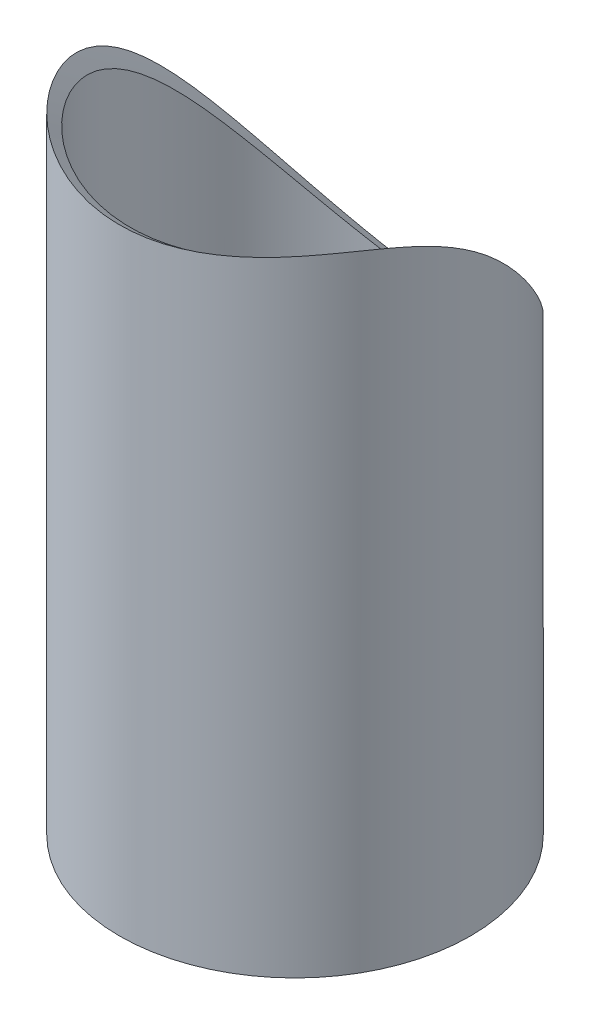
ISO-10303-21;
HEADER;
FILE_DESCRIPTION(('STEP AP214'),'2;1');
FILE_NAME('part.step','',(''),(''),'','','');
FILE_SCHEMA(('AUTOMOTIVE_DESIGN { 1 0 10303 214 1 1 1 1 }'));
ENDSEC;
DATA;
#1=APPLICATION_CONTEXT('core data for automotive mechanical design processes');
#2=APPLICATION_PROTOCOL_DEFINITION('international standard','automotive_design',2000,#1);
#3=PRODUCT_CONTEXT('',#1,'mechanical');
#4=PRODUCT('Part','Part','',(#3));
#5=PRODUCT_RELATED_PRODUCT_CATEGORY('part','',(#4));
#6=PRODUCT_DEFINITION_FORMATION('','',#4);
#7=PRODUCT_DEFINITION_CONTEXT('part definition',#1,'design');
#8=PRODUCT_DEFINITION('design','',#6,#7);
#9=PRODUCT_DEFINITION_SHAPE('','',#8);
#10=(LENGTH_UNIT() NAMED_UNIT(*) SI_UNIT(.MILLI.,.METRE.));
#11=(NAMED_UNIT(*) PLANE_ANGLE_UNIT() SI_UNIT($,.RADIAN.));
#12=(NAMED_UNIT(*) SI_UNIT($,.STERADIAN.) SOLID_ANGLE_UNIT());
#13=UNCERTAINTY_MEASURE_WITH_UNIT(LENGTH_MEASURE(1.E-05),#10,'distance_accuracy_value','');
#14=(GEOMETRIC_REPRESENTATION_CONTEXT(3) GLOBAL_UNCERTAINTY_ASSIGNED_CONTEXT((#13)) GLOBAL_UNIT_ASSIGNED_CONTEXT((#10,
#11,#12)) REPRESENTATION_CONTEXT('',''));
#15=CARTESIAN_POINT('',(0.,0.,0.));
#16=DIRECTION('',(0.,0.,1.));
#17=DIRECTION('',(1.,0.,0.));
#18=AXIS2_PLACEMENT_3D('',#15,#16,#17);
#19=CARTESIAN_POINT('',(0.,0.,0.));
#20=DIRECTION('',(0.,1.,0.));
#21=DIRECTION('',(0.,0.,1.));
#22=AXIS2_PLACEMENT_3D('',#19,#20,#21);
#23=PLANE('',#22);
#24=CARTESIAN_POINT('',(0.,0.,0.));
#25=DIRECTION('',(0.,1.,0.));
#26=DIRECTION('',(0.,0.,1.));
#27=AXIS2_PLACEMENT_3D('',#24,#25,#26);
#28=CIRCLE('',#27,50.);
#29=CARTESIAN_POINT('',(0.,0.,50.));
#30=VERTEX_POINT('',#29);
#31=EDGE_CURVE('E57',#30,#30,#28,.T.);
#32=ORIENTED_EDGE('',*,*,#31,.F.);
#33=EDGE_LOOP('',(#32));
#34=FACE_BOUND('',#33,.T.);
#35=CARTESIAN_POINT('',(0.,0.,0.));
#36=DIRECTION('',(0.,1.,0.));
#37=DIRECTION('',(1.,0.,0.));
#38=AXIS2_PLACEMENT_3D('',#35,#36,#37);
#39=CIRCLE('',#38,47.);
#40=CARTESIAN_POINT('',(47.,0.,0.));
#41=VERTEX_POINT('',#40);
#42=EDGE_CURVE('E95',#41,#41,#39,.T.);
#43=ORIENTED_EDGE('',*,*,#42,.T.);
#44=EDGE_LOOP('',(#43));
#45=FACE_BOUND('',#44,.T.);
#46=ADVANCED_FACE('F78',(#34,#45),#23,.F.);
#47=CARTESIAN_POINT('',(0.,200.,0.));
#48=DIRECTION('',(0.,-1.,0.));
#49=DIRECTION('',(0.,0.,-1.));
#50=AXIS2_PLACEMENT_3D('',#47,#48,#49);
#51=CYLINDRICAL_SURFACE('',#50,50.);
#52=CARTESIAN_POINT('',(0.,105.378700797082,-50.));
#53=CARTESIAN_POINT('',(0.784508287694175,105.378692823781,-50.0000046543676));
#54=CARTESIAN_POINT('',(1.56895656452334,105.409033269757,-49.9814986416041));
#55=CARTESIAN_POINT('',(3.13142400452315,105.529531153129,-49.9079723877951));
#56=CARTESIAN_POINT('',(3.90944386665171,105.619681998363,-49.8529561708188));
#57=CARTESIAN_POINT('',(5.45382192250284,105.857508432917,-49.7077250957132));
#58=CARTESIAN_POINT('',(6.22017123012948,106.005225780977,-49.6174846858779));
#59=CARTESIAN_POINT('',(7.73576342385866,106.354561585476,-49.4038861793247));
#60=CARTESIAN_POINT('',(8.48500381295672,106.556187855903,-49.2805232815594));
#61=CARTESIAN_POINT('',(10.1360984030255,107.062143743099,-48.9706121570084));
#62=CARTESIAN_POINT('',(11.0324693874669,107.379472663139,-48.7760288623184));
#63=CARTESIAN_POINT('',(12.788409588197,108.080562627752,-48.3453679830021));
#64=CARTESIAN_POINT('',(13.6479699938648,108.464339467021,-48.1092805326159));
#65=CARTESIAN_POINT('',(15.3288705743057,109.289833296735,-47.6003987707934));
#66=CARTESIAN_POINT('',(16.1501564385232,109.731629415196,-47.3275543159477));
#67=CARTESIAN_POINT('',(17.7524421530552,110.664326867815,-46.7501465953852));
#68=CARTESIAN_POINT('',(18.533439837422,111.155230837916,-46.445581626982));
#69=CARTESIAN_POINT('',(20.4828218497372,112.465920797607,-45.6301803236134));
#70=CARTESIAN_POINT('',(21.6228453718274,113.31576248767,-45.0994478121806));
#71=CARTESIAN_POINT('',(23.2637174259674,114.648928723538,-44.2625865344179));
#72=CARTESIAN_POINT('',(23.7993514343827,115.103248189529,-43.976714391327));
#73=CARTESIAN_POINT('',(24.8485244324733,116.029149536948,-43.3925260405617));
#74=CARTESIAN_POINT('',(25.3620641253994,116.500730868055,-43.0942102295591));
#75=CARTESIAN_POINT('',(26.3689081284511,117.459997041181,-42.485615146626));
#76=CARTESIAN_POINT('',(26.8621674945559,117.947713737531,-42.175311978546));
#77=CARTESIAN_POINT('',(27.8281777268121,118.936451586529,-41.544256460195));
#78=CARTESIAN_POINT('',(28.3009286559222,119.437472698326,-41.2235041420072));
#79=CARTESIAN_POINT('',(29.6895964541063,120.957864318011,-40.2468587438711));
#80=CARTESIAN_POINT('',(30.5761972469106,121.994822029819,-39.5764132254726));
#81=CARTESIAN_POINT('',(32.1873165465217,123.992830433725,-38.274436569561));
#82=CARTESIAN_POINT('',(32.9190611268501,124.950316353836,-37.6462846967711));
#83=CARTESIAN_POINT('',(34.329141801839,126.887934056726,-36.3650603991312));
#84=CARTESIAN_POINT('',(35.0074692457018,127.868069474438,-35.7119839631197));
#85=CARTESIAN_POINT('',(36.3145373915224,129.846368560085,-34.382034110091));
#86=CARTESIAN_POINT('',(36.9432412134723,130.844544971358,-33.7051435247174));
#87=CARTESIAN_POINT('',(38.1534394627191,132.853761794578,-32.3288518975329));
#88=CARTESIAN_POINT('',(38.7349362953945,133.864801548047,-31.629452005197));
#89=CARTESIAN_POINT('',(39.8541363019394,135.897621247775,-30.2070879264169));
#90=CARTESIAN_POINT('',(40.391761702819,136.919416791213,-29.4840849425618));
#91=CARTESIAN_POINT('',(41.4240002302462,138.968380092313,-28.0153159179043));
#92=CARTESIAN_POINT('',(41.9186123333826,139.995547977183,-27.2695493360597));
#93=CARTESIAN_POINT('',(42.8659364503367,142.051162413901,-25.7547874135956));
#94=CARTESIAN_POINT('',(43.3186691993174,143.079608074699,-24.9858038209789));
#95=CARTESIAN_POINT('',(44.1833202134398,145.134652353267,-23.4228921830174));
#96=CARTESIAN_POINT('',(44.5952403589046,146.161251053988,-22.6289652890848));
#97=CARTESIAN_POINT('',(45.2752228218636,147.938794646045,-21.2271175472776));
#98=CARTESIAN_POINT('',(45.5525788204349,148.691050645539,-20.6253473038897));
#99=CARTESIAN_POINT('',(46.0851373592064,150.19077548316,-19.4062523815905));
#100=CARTESIAN_POINT('',(46.3403404911,150.938244448651,-18.7889281186891));
#101=CARTESIAN_POINT('',(46.8282990270471,152.426706039592,-17.5374343521604));
#102=CARTESIAN_POINT('',(47.0610492379055,153.167697130889,-16.9032609945152));
#103=CARTESIAN_POINT('',(47.5034252082677,154.64091067795,-15.6168892622334));
#104=CARTESIAN_POINT('',(47.7130510116875,155.373133150364,-14.9646909218312));
#105=CARTESIAN_POINT('',(48.1077481902566,156.824438459781,-13.6425536779964));
#106=CARTESIAN_POINT('',(48.2928836457561,157.543551165352,-12.9726668043906));
#107=CARTESIAN_POINT('',(48.6380279183067,158.967861465126,-11.6118483091303));
#108=CARTESIAN_POINT('',(48.7980358072915,159.673058544527,-10.920915911301));
#109=CARTESIAN_POINT('',(49.0912143207011,161.065883423628,-9.51666490161876));
#110=CARTESIAN_POINT('',(49.2243985227044,161.753519957401,-8.80335782775194));
#111=CARTESIAN_POINT('',(49.4619286672991,163.107646081471,-7.35240974203875));
#112=CARTESIAN_POINT('',(49.5662784263441,163.774138460008,-6.61477196502303));
#113=CARTESIAN_POINT('',(49.7602228324174,165.204299686616,-4.97256350716011));
#114=CARTESIAN_POINT('',(49.8433771466499,165.962742996774,-4.06263608028962));
#115=CARTESIAN_POINT('',(49.9600759667394,167.434848922495,-2.20400150791994));
#116=CARTESIAN_POINT('',(49.9936225209762,168.148513385878,-1.2552959652905));
#117=CARTESIAN_POINT('',(50.004722559178,169.51991514228,0.679983616997844));
#118=CARTESIAN_POINT('',(49.9823680920509,170.177742534103,1.66649277295709));
#119=CARTESIAN_POINT('',(49.8747646958808,171.427920927643,3.67701092687834));
#120=CARTESIAN_POINT('',(49.7895277386824,172.020284367996,4.70101275155877));
#121=CARTESIAN_POINT('',(49.5664286140436,173.049125567855,6.63110384946461));
#122=CARTESIAN_POINT('',(49.437947588403,173.495760699128,7.53285691482797));
#123=CARTESIAN_POINT('',(49.1257901854911,174.328320706774,9.35470052245037));
#124=CARTESIAN_POINT('',(48.9421192625234,174.714251576685,10.2747892442486));
#125=CARTESIAN_POINT('',(48.5166462996176,175.422008438475,12.1258584091545));
#126=CARTESIAN_POINT('',(48.2748606774584,175.743852488428,13.0568357056294));
#127=CARTESIAN_POINT('',(47.7314668462549,176.3228923433,14.9214608008205));
#128=CARTESIAN_POINT('',(47.4298569691732,176.580086345174,15.8551086732828));
#129=CARTESIAN_POINT('',(46.7671521165566,177.031530076969,17.7145723194312));
#130=CARTESIAN_POINT('',(46.4061574352119,177.225884322423,18.640398577667));
#131=CARTESIAN_POINT('',(45.6253516508151,177.556741911518,20.4773893884002));
#132=CARTESIAN_POINT('',(45.2055392438555,177.693243972386,21.3885536153612));
#133=CARTESIAN_POINT('',(44.3086034632815,177.914702463386,23.1896726463735));
#134=CARTESIAN_POINT('',(43.8314245066748,177.999608411486,24.079605862789));
#135=CARTESIAN_POINT('',(42.8225564958236,178.124794518621,25.8311903284492));
#136=CARTESIAN_POINT('',(42.290864723984,178.165072451661,26.6928401648697));
#137=CARTESIAN_POINT('',(41.1385394180996,178.20979206864,28.4391748057581));
#138=CARTESIAN_POINT('',(40.5143401162701,178.211667044011,29.321568812401));
#139=CARTESIAN_POINT('',(39.2104434143775,178.181611225658,31.0436437773333));
#140=CARTESIAN_POINT('',(38.5307446643327,178.149679609388,31.8833236958284));
#141=CARTESIAN_POINT('',(37.1190549211781,178.059928140223,33.516277394089));
#142=CARTESIAN_POINT('',(36.3870534174881,178.002103071504,34.3095417877651));
#143=CARTESIAN_POINT('',(34.8741503894472,177.867659331263,35.8462906998241));
#144=CARTESIAN_POINT('',(34.0932450813115,177.791039204189,36.5897713571082));
#145=CARTESIAN_POINT('',(32.3150889944707,177.607681030358,38.176433099356));
#146=CARTESIAN_POINT('',(31.307099857555,177.498002220397,39.0072796219701));
#147=CARTESIAN_POINT('',(29.22981588175,177.269867059282,40.5872040615956));
#148=CARTESIAN_POINT('',(28.1605142554598,177.151409735905,41.3362728989146));
#149=CARTESIAN_POINT('',(25.9661601708709,176.913741012212,42.7488215931541));
#150=CARTESIAN_POINT('',(24.841082563706,176.794529293272,43.4122623463274));
#151=CARTESIAN_POINT('',(22.5419894061367,176.562167623039,44.6493325217226));
#152=CARTESIAN_POINT('',(21.3679731881529,176.449017754484,45.222960718289));
#153=CARTESIAN_POINT('',(18.8825632881315,176.225829224936,46.3188606558287));
#154=CARTESIAN_POINT('',(17.5676706512956,176.116754100102,46.8334169262136));
#155=CARTESIAN_POINT('',(14.8976939575696,175.917835866992,47.7498802294062));
#156=CARTESIAN_POINT('',(13.5426074760248,175.827993921637,48.1517804510016));
#157=CARTESIAN_POINT('',(10.8020833232902,175.671848176734,48.8396420047932));
#158=CARTESIAN_POINT('',(9.41664821805117,175.605542395317,49.1256130991255));
#159=CARTESIAN_POINT('',(6.62556189271374,175.499472692168,49.57923731244));
#160=CARTESIAN_POINT('',(5.21991136124116,175.459707868513,49.7468944520176));
#161=CARTESIAN_POINT('',(2.42741586597707,175.408979775967,49.9602727813991));
#162=CARTESIAN_POINT('',(1.04076345849506,175.397451753357,50.0083852277991));
#163=CARTESIAN_POINT('',(-1.73169268285991,175.402027593119,49.989227827753));
#164=CARTESIAN_POINT('',(-3.11749642461173,175.418131194952,49.9219590692429));
#165=CARTESIAN_POINT('',(-5.87799166133068,175.477295707567,49.6726250913319));
#166=CARTESIAN_POINT('',(-7.25268434912917,175.520353684647,49.4905723649535));
#167=CARTESIAN_POINT('',(-9.9812109812231,175.631599774585,49.0131983838995));
#168=CARTESIAN_POINT('',(-11.3350449716889,175.69978783181,48.7178773799788));
#169=CARTESIAN_POINT('',(-13.9973844508889,175.857419048325,48.020265326404));
#170=CARTESIAN_POINT('',(-15.3062269599385,175.946616856902,47.619203104595));
#171=CARTESIAN_POINT('',(-17.8854616667014,176.142628456761,46.7116603819295));
#172=CARTESIAN_POINT('',(-19.1558540829128,176.249442147916,46.2051804802521));
#173=CARTESIAN_POINT('',(-21.6504623783373,176.47550363613,45.0901892683722));
#174=CARTESIAN_POINT('',(-22.8746587316493,176.594756612542,44.4816353929309));
#175=CARTESIAN_POINT('',(-25.2688305372132,176.839184299975,43.1665502186775));
#176=CARTESIAN_POINT('',(-26.43880533731,176.964359082184,42.460017741826));
#177=CARTESIAN_POINT('',(-28.1620990422436,177.15214454884,41.3205438850233));
#178=CARTESIAN_POINT('',(-28.7382918890508,177.215541396764,40.9218961381801));
#179=CARTESIAN_POINT('',(-29.8735332467601,177.340530592822,40.1006559956652));
#180=CARTESIAN_POINT('',(-30.432583302615,177.402123103546,39.6780657675848));
#181=CARTESIAN_POINT('',(-31.5327324983827,177.522165211647,38.8095105596525));
#182=CARTESIAN_POINT('',(-32.0738281774275,177.580614204416,38.3635411154984));
#183=CARTESIAN_POINT('',(-33.1370118041871,177.692863407755,37.4490327024464));
#184=CARTESIAN_POINT('',(-33.6591016700406,177.746664088206,36.9804960222694));
#185=CARTESIAN_POINT('',(-34.6833509277258,177.847989567626,36.0216215698587));
#186=CARTESIAN_POINT('',(-35.1855133855237,177.895515334671,35.5312871761567));
#187=CARTESIAN_POINT('',(-36.169041269776,177.982524037549,34.5295972740661));
#188=CARTESIAN_POINT('',(-36.6504088942208,178.022007825056,34.0182439985544));
#189=CARTESIAN_POINT('',(-37.5914405629211,178.091012035684,32.9753959175629));
#190=CARTESIAN_POINT('',(-38.0511075636167,178.120533819391,32.4439038736282));
#191=CARTESIAN_POINT('',(-38.9478416955929,178.167543871972,31.3617527170236));
#192=CARTESIAN_POINT('',(-39.3849100543741,178.185032795076,30.8110946481273));
#193=CARTESIAN_POINT('',(-40.482460203742,178.211790911204,29.3667179149315));
#194=CARTESIAN_POINT('',(-41.1254221185362,178.210402365083,28.4593383411594));
#195=CARTESIAN_POINT('',(-42.3488744635267,178.162719365131,26.6046409023948));
#196=CARTESIAN_POINT('',(-42.9293730240861,178.11643076346,25.65732825757));
#197=CARTESIAN_POINT('',(-44.0235626007675,177.969351174381,23.7307977513489));
#198=CARTESIAN_POINT('',(-44.5373603887596,177.868648658806,22.751634098682));
#199=CARTESIAN_POINT('',(-45.4960289063396,177.603535158022,20.7683476572943));
#200=CARTESIAN_POINT('',(-45.9409001071064,177.439124608344,19.7642250392465));
#201=CARTESIAN_POINT('',(-46.7624540669444,177.037358887281,17.7336174048877));
#202=CARTESIAN_POINT('',(-47.1386047002256,176.799469940357,16.707021576428));
#203=CARTESIAN_POINT('',(-47.8177209274137,176.246131308212,14.6505329088618));
#204=CARTESIAN_POINT('',(-48.1206909514101,175.930686320288,13.6206402731584));
#205=CARTESIAN_POINT('',(-48.6546184299569,175.221100334919,11.5694270973482));
#206=CARTESIAN_POINT('',(-48.8855767743204,174.82696030997,10.5481064514734));
#207=CARTESIAN_POINT('',(-49.2787724519142,173.962796919,8.52440101478001));
#208=CARTESIAN_POINT('',(-49.4410021242218,173.492765101672,7.52201834679696));
#209=CARTESIAN_POINT('',(-49.645167337843,172.702052159263,5.97304910313877));
#210=CARTESIAN_POINT('',(-49.708772081715,172.404851916937,5.4170768406208));
#211=CARTESIAN_POINT('',(-49.8165506543704,171.78962866292,4.31483634598037));
#212=CARTESIAN_POINT('',(-49.8607237640114,171.471604881076,3.76856847372398));
#213=CARTESIAN_POINT('',(-49.9657169301231,170.488584798441,2.14546584936045));
#214=CARTESIAN_POINT('',(-49.9990236779655,169.794587939928,1.08423134680209));
#215=CARTESIAN_POINT('',(-50.0009371437552,168.34107836037,-0.995650190844989));
#216=CARTESIAN_POINT('',(-49.969383369587,167.581407589895,-2.01418520652099));
#217=CARTESIAN_POINT('',(-49.8491902680202,166.010305793089,-4.0068078148378));
#218=CARTESIAN_POINT('',(-49.7605480554845,165.198872152634,-4.98089315841545));
#219=CARTESIAN_POINT('',(-49.5461333211136,163.633048967083,-6.77477964758046));
#220=CARTESIAN_POINT('',(-49.4259593726464,162.883187165269,-7.5992453041899));
#221=CARTESIAN_POINT('',(-49.1498108499686,161.357665832852,-9.21793415755686));
#222=CARTESIAN_POINT('',(-48.9938298348891,160.582001682487,-10.0121518834039));
#223=CARTESIAN_POINT('',(-48.6487538789137,159.00970454246,-11.5731636333076));
#224=CARTESIAN_POINT('',(-48.4596357433863,158.213057199498,-12.3399379923877));
#225=CARTESIAN_POINT('',(-48.0504721146887,156.603738340752,-13.8478278772043));
#226=CARTESIAN_POINT('',(-47.8304282569304,155.791067674266,-14.5889447571765));
#227=CARTESIAN_POINT('',(-47.3601904673586,154.150805073256,-16.0500191993364));
#228=CARTESIAN_POINT('',(-47.1099050473001,153.32317464533,-16.7699039223426));
#229=CARTESIAN_POINT('',(-46.5807563632428,151.658616482038,-18.1880703390306));
#230=CARTESIAN_POINT('',(-46.3018928540075,150.821688666945,-18.8863518472623));
#231=CARTESIAN_POINT('',(-45.7163048502147,149.141593279784,-20.2627387087118));
#232=CARTESIAN_POINT('',(-45.4095906871385,148.298428127273,-20.9408514208236));
#233=CARTESIAN_POINT('',(-44.7684600619697,146.607978056833,-22.2785789675119));
#234=CARTESIAN_POINT('',(-44.4340434515686,145.760693116871,-22.9381937030321));
#235=CARTESIAN_POINT('',(-43.6945830685708,143.959829725872,-24.3201755307333));
#236=CARTESIAN_POINT('',(-43.2859120617205,143.00600028654,-25.0402774287713));
#237=CARTESIAN_POINT('',(-42.4330327765444,141.098847996971,-26.4598438896716));
#238=CARTESIAN_POINT('',(-41.9888238509063,140.14552515628,-27.1593080763065));
#239=CARTESIAN_POINT('',(-41.0637625158487,138.241861921064,-28.5386981528096));
#240=CARTESIAN_POINT('',(-40.5828959358336,137.291522829277,-29.2186163455663));
#241=CARTESIAN_POINT('',(-39.5833544174434,135.397084161576,-30.55907434499));
#242=CARTESIAN_POINT('',(-39.0646800956123,134.452984484188,-31.2196144674158));
#243=CARTESIAN_POINT('',(-37.9900377152208,132.577931106097,-32.5186823039498));
#244=CARTESIAN_POINT('',(-37.4342335549367,131.6469390843,-33.1572900714239));
#245=CARTESIAN_POINT('',(-36.2813073754113,129.797331051474,-34.4150343325215));
#246=CARTESIAN_POINT('',(-35.6841833426345,128.878715646172,-35.0341698751138));
#247=CARTESIAN_POINT('',(-34.4465736388567,127.058204673564,-36.2517117951371));
#248=CARTESIAN_POINT('',(-33.8061175479504,126.156298225272,-36.850131900192));
#249=CARTESIAN_POINT('',(-32.4786932125647,124.372973141695,-38.0252569966702));
#250=CARTESIAN_POINT('',(-31.7917326838283,123.491551140191,-38.6019655657563));
#251=CARTESIAN_POINT('',(-30.4240151732825,121.82260407437,-39.6872792795528));
#252=CARTESIAN_POINT('',(-29.7470336935052,121.033152495745,-40.1976702267111));
#253=CARTESIAN_POINT('',(-28.347908372825,119.480684646846,-41.1962958046504));
#254=CARTESIAN_POINT('',(-27.625768045254,118.71766632724,-41.6845321539589));
#255=CARTESIAN_POINT('',(-26.1321580587153,117.222744644546,-42.636790076213));
#256=CARTESIAN_POINT('',(-25.3606197355808,116.490887054383,-43.1007762403597));
#257=CARTESIAN_POINT('',(-23.7659805294562,115.066545842484,-44.0001832631054));
#258=CARTESIAN_POINT('',(-22.9428783934049,114.374063178385,-44.4356034269902));
#259=CARTESIAN_POINT('',(-21.2317456474263,113.028997546976,-45.2784017556938));
#260=CARTESIAN_POINT('',(-20.3430416626558,112.377009196824,-45.6853697518962));
#261=CARTESIAN_POINT('',(-18.5073663120883,111.133303495899,-46.4593305852331));
#262=CARTESIAN_POINT('',(-17.5603884816911,110.541592851428,-46.8263189746803));
#263=CARTESIAN_POINT('',(-15.6096751219389,109.432994123901,-47.5121508362466));
#264=CARTESIAN_POINT('',(-14.6060694641284,108.915943795845,-47.8310987726197));
#265=CARTESIAN_POINT('',(-12.5424428018928,107.970452018342,-48.4131648664232));
#266=CARTESIAN_POINT('',(-11.4824500813476,107.541966661751,-48.676310690105));
#267=CARTESIAN_POINT('',(-9.57282876969586,106.879913190806,-49.0822993078034));
#268=CARTESIAN_POINT('',(-8.73375652795192,106.624245268736,-49.2388578674407));
#269=CARTESIAN_POINT('',(-7.03138163196537,106.180064625186,-49.510625265225));
#270=CARTESIAN_POINT('',(-6.16808243409557,105.991542376291,-49.6258399697405));
#271=CARTESIAN_POINT('',(-4.42522021591585,105.687620864994,-49.8114867285976));
#272=CARTESIAN_POINT('',(-3.54568357350042,105.572112189376,-49.881985791331));
#273=CARTESIAN_POINT('',(-1.77740497153038,105.417660673424,-49.9762373474545));
#274=CARTESIAN_POINT('',(-0.888663984058778,105.378709828962,-49.9999947276926));
#275=CARTESIAN_POINT('',(0.,105.378700797082,-50.));
#276=B_SPLINE_CURVE_WITH_KNOTS('',3,(#52,#53,#54,#55,#56,#57,#58,#59,#60,#61,#62,#63,#64,#65,
#66,#67,#68,#69,#70,#71,#72,#73,#74,#75,#76,#77,#78,#79,#80,#81,#82,#83,#84,#85,#86,#87,#88,#89,
#90,#91,#92,#93,#94,#95,#96,#97,#98,#99,#100,#101,#102,#103,#104,#105,#106,#107,#108,#109,#110,
#111,#112,#113,#114,#115,#116,#117,#118,#119,#120,#121,#122,#123,#124,#125,#126,#127,#128,#129,
#130,#131,#132,#133,#134,#135,#136,#137,#138,#139,#140,#141,#142,#143,#144,#145,#146,#147,#148,
#149,#150,#151,#152,#153,#154,#155,#156,#157,#158,#159,#160,#161,#162,#163,#164,#165,#166,#167,
#168,#169,#170,#171,#172,#173,#174,#175,#176,#177,#178,#179,#180,#181,#182,#183,#184,#185,#186,
#187,#188,#189,#190,#191,#192,#193,#194,#195,#196,#197,#198,#199,#200,#201,#202,#203,#204,#205,
#206,#207,#208,#209,#210,#211,#212,#213,#214,#215,#216,#217,#218,#219,#220,#221,#222,#223,#224,
#225,#226,#227,#228,#229,#230,#231,#232,#233,#234,#235,#236,#237,#238,#239,#240,#241,#242,#243,
#244,#245,#246,#247,#248,#249,#250,#251,#252,#253,#254,#255,#256,#257,#258,#259,#260,#261,#262,
#263,#264,#265,#266,#267,#268,#269,#270,#271,#272,#273,#274,#275),.UNSPECIFIED.,.T.,.F.,(4,2,2,
2,2,2,2,2,2,2,2,2,2,2,2,2,2,2,2,2,2,2,2,2,2,2,2,2,2,2,2,2,2,2,2,2,2,2,2,2,2,2,2,2,2,2,2,2,2,2,2,
2,2,2,2,2,2,2,2,2,2,2,2,2,2,2,2,2,2,2,2,2,2,2,2,2,2,2,2,2,2,2,2,2,2,2,2,2,2,2,2,2,2,2,2,2,2,2,2,
2,2,2,2,2,2,2,2,2,2,2,2,4),(0.,2.3526276158978,4.70499597374962,7.05907392544265,
9.41349328104756,12.3208548071335,15.2289083653832,18.1409700003598,21.0531880289453,
25.5984950007056,27.8730002936618,30.147433136635,32.4266610765879,34.7058820190529,
39.2631031651652,43.3385387774789,47.4146330468187,51.4937286686828,55.5726163142443,
59.6585844407444,63.7446497577037,67.8286810445994,71.912524083961,74.9195883522681,
77.9265722784536,80.9342500386642,83.9419220868475,86.9415617989342,89.9413122742495,
92.9395405024135,95.9373717024212,99.4975856587699,103.057652604367,106.611861259526,
110.165393423398,113.205576803821,116.245459827969,119.284485072777,122.323595064493,
125.357624069739,128.391720345855,131.428780445323,134.465992023232,137.705582083684,
140.945250968169,144.185572726302,147.426145505086,151.354561795161,155.283413810634,
159.214053712684,163.144747250777,167.38812826344,171.631765776647,175.875045868234,
180.118181755913,184.275732993735,188.433245029982,192.590304643049,196.747355053214,
200.858076433952,204.968774450569,209.081190925228,213.193656849545,215.30370014064,
217.413552706918,219.523809631237,221.633852986607,223.743570428827,225.853064327951,
227.962270000474,230.071360985712,233.404244186476,236.73669304596,240.063739893824,
243.390763997147,246.742549101038,250.094131249094,253.445671981656,256.79758619945,
258.697810259078,260.59810463788,264.398352674726,268.208015436736,272.017870746694,
275.379283115618,278.741300599858,282.105680829026,285.469883210176,288.844530704936,
292.21920716091,295.592636821344,298.966084543001,302.754616217378,306.543216914407,
310.333289654773,314.123300602928,317.897565112887,321.672013674095,325.443911156213,
329.215184353837,332.68932921424,336.163204123659,339.642017272926,343.120914994254,
346.642547248519,350.164570881282,353.678821713245,357.191326112322,359.860968833534,
362.530232603478,365.19548685235,367.8604624338),.UNSPECIFIED.);
#277=CARTESIAN_POINT('',(0.,105.378700797082,-50.));
#278=VERTEX_POINT('',#277);
#279=EDGE_CURVE('E96',#278,#278,#276,.T.);
#280=ORIENTED_EDGE('',*,*,#279,.T.);
#281=EDGE_LOOP('',(#280));
#282=FACE_BOUND('',#281,.T.);
#283=ORIENTED_EDGE('',*,*,#31,.T.);
#284=EDGE_LOOP('',(#283));
#285=FACE_BOUND('',#284,.T.);
#286=ADVANCED_FACE('F85',(#282,#285),#51,.T.);
#287=CARTESIAN_POINT('',(0.,200.,0.));
#288=DIRECTION('',(0.,-1.,0.));
#289=DIRECTION('',(0.,0.,-1.));
#290=AXIS2_PLACEMENT_3D('',#287,#288,#289);
#291=CYLINDRICAL_SURFACE('',#290,47.);
#292=CARTESIAN_POINT('',(0.,107.479323411711,-47.));
#293=CARTESIAN_POINT('',(0.753566395104636,107.479337014195,-46.9999918196145));
#294=CARTESIAN_POINT('',(1.50744680147842,107.508105998047,-46.981819982514));
#295=CARTESIAN_POINT('',(2.63356207783358,107.593795023295,-46.9276692165626));
#296=CARTESIAN_POINT('',(3.00829282237925,107.629469201329,-46.9051229427699));
#297=CARTESIAN_POINT('',(3.75560296661144,107.714752373048,-46.8512086500331));
#298=CARTESIAN_POINT('',(4.12818201294913,107.764363592573,-46.8198392219699));
#299=CARTESIAN_POINT('',(5.24308154711569,107.933890912112,-46.7126103475428));
#300=CARTESIAN_POINT('',(5.98113493603446,108.074390261216,-46.623699988813));
#301=CARTESIAN_POINT('',(7.44085098110136,108.406801677509,-46.4131222603181));
#302=CARTESIAN_POINT('',(8.16250971842734,108.598725899422,-46.291447146279));
#303=CARTESIAN_POINT('',(9.31261281105101,108.94704433021,-46.0703257207878));
#304=CARTESIAN_POINT('',(9.74737396105099,109.088839740059,-45.9802483160473));
#305=CARTESIAN_POINT('',(10.6084665660755,109.389239290848,-45.7892441988644));
#306=CARTESIAN_POINT('',(11.0348003679948,109.547838671587,-45.6883205588099));
#307=CARTESIAN_POINT('',(12.3008374869722,110.047406619744,-45.3701064717993));
#308=CARTESIAN_POINT('',(13.127442812323,110.412103953755,-45.1373988765271));
#309=CARTESIAN_POINT('',(14.7434258307855,111.196361480477,-44.6357300818591));
#310=CARTESIAN_POINT('',(15.5327668939613,111.615974186269,-44.3667341739124));
#311=CARTESIAN_POINT('',(17.072739988048,112.501844938679,-43.7972092551907));
#312=CARTESIAN_POINT('',(17.8233703152563,112.96810503565,-43.4966788583114));
#313=CARTESIAN_POINT('',(19.6893977378403,114.208029152073,-42.6948808510643));
#314=CARTESIAN_POINT('',(20.7780635011116,115.009593483523,-42.1741992100051));
#315=CARTESIAN_POINT('',(22.3450986283865,116.266658258159,-41.3526850550806));
#316=CARTESIAN_POINT('',(22.8566421989866,116.69498284835,-41.071977336515));
#317=CARTESIAN_POINT('',(23.8585876313859,117.567773202019,-40.4981599804241));
#318=CARTESIAN_POINT('',(24.3489902148382,118.012238413576,-40.2050507669049));
#319=CARTESIAN_POINT('',(25.7917087483246,119.368722862629,-39.3074252430245));
#320=CARTESIAN_POINT('',(26.7134015405283,120.302097229597,-38.6857417704053));
#321=CARTESIAN_POINT('',(28.4810954277406,122.211909810047,-37.4034657721921));
#322=CARTESIAN_POINT('',(29.3271043643848,123.188343546443,-36.7428772893509));
#323=CARTESIAN_POINT('',(30.8429452200202,125.043744264686,-35.4761267599708));
#324=CARTESIAN_POINT('',(31.5213221460655,125.918667949701,-34.8742123054275));
#325=CARTESIAN_POINT('',(32.8290332541604,127.688079158991,-33.6460895029549));
#326=CARTESIAN_POINT('',(33.4583600865968,128.582569589508,-33.0198775352874));
#327=CARTESIAN_POINT('',(34.6711695764382,130.38696369005,-31.7440567815268));
#328=CARTESIAN_POINT('',(35.25462004399,131.296877647547,-31.0944320254667));
#329=CARTESIAN_POINT('',(36.377571124052,133.127429324422,-29.772876018093));
#330=CARTESIAN_POINT('',(36.9170738126603,134.048066534881,-29.1009458226042));
#331=CARTESIAN_POINT('',(37.9548444278587,135.897834650448,-27.7338662257841));
#332=CARTESIAN_POINT('',(38.4530499343682,136.82697613804,-27.0386838273073));
#333=CARTESIAN_POINT('',(39.4087761584793,138.688994098608,-25.6256877866));
#334=CARTESIAN_POINT('',(39.8662958906629,139.621870661476,-24.9078735967928));
#335=CARTESIAN_POINT('',(40.7413567127722,141.487524526005,-23.4491976744465));
#336=CARTESIAN_POINT('',(41.1589169226058,142.420301659659,-22.7083471914681));
#337=CARTESIAN_POINT('',(41.9547053721607,144.282750562388,-21.2020819688056));
#338=CARTESIAN_POINT('',(42.3329355976987,145.212422485951,-20.4366684718927));
#339=CARTESIAN_POINT('',(42.9561585159739,146.822787768229,-19.0832099408221));
#340=CARTESIAN_POINT('',(43.2101306819865,147.505023650802,-18.5011165268477));
#341=CARTESIAN_POINT('',(43.696235353509,148.864194719981,-17.3218306230252));
#342=CARTESIAN_POINT('',(43.9283685174152,149.541130065823,-16.7246385890554));
#343=CARTESIAN_POINT('',(44.3703429925043,150.888072921716,-15.5141198501674));
#344=CARTESIAN_POINT('',(44.5801801395342,151.558079116615,-14.9007901578659));
#345=CARTESIAN_POINT('',(44.9767733985537,152.889067030987,-13.6570821889638));
#346=CARTESIAN_POINT('',(45.1635295241335,153.550048755775,-13.0267039224018));
#347=CARTESIAN_POINT('',(45.5124836682578,154.859013336986,-11.7495071402413));
#348=CARTESIAN_POINT('',(45.6747459669343,155.507026204934,-11.1027370487766));
#349=CARTESIAN_POINT('',(45.9740071980224,156.789374595109,-9.78998999467077));
#350=CARTESIAN_POINT('',(46.1110053409859,157.423709689391,-9.12401243259115));
#351=CARTESIAN_POINT('',(46.3580352355024,158.675548154233,-7.77203843588461));
#352=CARTESIAN_POINT('',(46.4680788486128,159.293058821807,-7.08605095604712));
#353=CARTESIAN_POINT('',(46.6592492388847,160.508186632752,-5.6928677501306));
#354=CARTESIAN_POINT('',(46.7403794198399,161.105806110271,-4.98567453110155));
#355=CARTESIAN_POINT('',(46.8887121168528,162.432884290857,-3.35877583781129));
#356=CARTESIAN_POINT('',(46.9465271985867,163.155315041769,-2.43241508209147));
#357=CARTESIAN_POINT('',(47.0063468781554,164.554140571101,-0.543732225709095));
#358=CARTESIAN_POINT('',(47.008357151053,165.23054002369,0.418586208275327));
#359=CARTESIAN_POINT('',(46.9500668933514,166.527318206408,2.37686596070397));
#360=CARTESIAN_POINT('',(46.8898476554989,167.147768874737,3.37278174760533));
#361=CARTESIAN_POINT('',(46.700259252199,168.324368409495,5.39602028704955));
#362=CARTESIAN_POINT('',(46.570891661883,168.880518740272,6.4233423236864));
#363=CARTESIAN_POINT('',(46.3191748830701,169.663290299814,7.98863347667652));
#364=CARTESIAN_POINT('',(46.2248979540803,169.917034625355,8.51777423629753));
#365=CARTESIAN_POINT('',(46.0162733016332,170.40507105972,9.58101924320931));
#366=CARTESIAN_POINT('',(45.9019281430127,170.639365648704,10.1151228479681));
#367=CARTESIAN_POINT('',(45.6525352433135,171.087880057338,11.1869952169564));
#368=CARTESIAN_POINT('',(45.5174848938082,171.302097342177,11.7247644348096));
#369=CARTESIAN_POINT('',(45.2262414927961,171.710000246257,12.8022843376435));
#370=CARTESIAN_POINT('',(45.0700512049196,171.903688543367,13.3420347546631));
#371=CARTESIAN_POINT('',(44.7361867170713,172.27044841657,14.4219640621463));
#372=CARTESIAN_POINT('',(44.5585103466077,172.44351790627,14.9621429904125));
#373=CARTESIAN_POINT('',(44.1815660032566,172.769149797288,16.0410640924531));
#374=CARTESIAN_POINT('',(43.9823006272962,172.921714660159,16.5798064310634));
#375=CARTESIAN_POINT('',(43.5621691632239,173.206794005955,17.654179739043));
#376=CARTESIAN_POINT('',(43.3413027466306,173.339308183896,18.1898106609666));
#377=CARTESIAN_POINT('',(42.8781735306822,173.584964412698,19.2561759124369));
#378=CARTESIAN_POINT('',(42.6359113754195,173.698107046415,19.7869103888544));
#379=CARTESIAN_POINT('',(41.9496553030152,173.980131783935,21.2186456073451));
#380=CARTESIAN_POINT('',(41.4851257230118,174.131134748177,22.1134594565657));
#381=CARTESIAN_POINT('',(40.4963002797098,174.384517616183,23.8761675307097));
#382=CARTESIAN_POINT('',(39.9720116391362,174.486903388308,24.744064992762));
#383=CARTESIAN_POINT('',(38.8661484118779,174.649778596259,26.4471893378487));
#384=CARTESIAN_POINT('',(38.2845466083067,174.710248016263,27.2824004331852));
#385=CARTESIAN_POINT('',(37.0674059051342,174.796101338959,28.9144255667313));
#386=CARTESIAN_POINT('',(36.4318623854265,174.821482233094,29.7112363067696));
#387=CARTESIAN_POINT('',(35.0466353776432,174.844972172628,31.3365639051849));
#388=CARTESIAN_POINT('',(34.2918519313633,174.840227951579,32.160776393236));
#389=CARTESIAN_POINT('',(32.7258277433405,174.804967077756,33.7530355966498));
#390=CARTESIAN_POINT('',(31.9145849181586,174.774449473441,34.5210802371843));
#391=CARTESIAN_POINT('',(30.2397832955725,174.695096140101,35.9972472531056));
#392=CARTESIAN_POINT('',(29.3762104309245,174.64625546703,36.7053533922447));
#393=CARTESIAN_POINT('',(27.6013332035364,174.536847907555,38.0580034171548));
#394=CARTESIAN_POINT('',(26.6900259549258,174.476280311581,38.7025434531127));
#395=CARTESIAN_POINT('',(24.6858415419625,174.339748057015,40.0156086143004));
#396=CARTESIAN_POINT('',(23.5860671554867,174.262831704201,40.6735393524856));
#397=CARTESIAN_POINT('',(21.3364477922425,174.108515468799,41.8974461739945));
#398=CARTESIAN_POINT('',(20.1865984737838,174.031115544784,42.4634142635928));
#399=CARTESIAN_POINT('',(17.8439230050453,173.881905731009,43.4998304179734));
#400=CARTESIAN_POINT('',(16.6510866597875,173.810097180256,43.9702556455343));
#401=CARTESIAN_POINT('',(14.2304526943035,173.676996592611,44.8122343348748));
#402=CARTESIAN_POINT('',(13.0026552969472,173.615704488696,45.1837884267822));
#403=CARTESIAN_POINT('',(10.4808056695373,173.505702730233,45.8355979865757));
#404=CARTESIAN_POINT('',(9.18588695789318,173.457453524443,46.1125859638812));
#405=CARTESIAN_POINT('',(6.5767239302554,173.379131231309,46.55639535129));
#406=CARTESIAN_POINT('',(5.26247906185034,173.349058664558,46.723213606063));
#407=CARTESIAN_POINT('',(2.62438689120061,173.308850420599,46.9453368548967));
#408=CARTESIAN_POINT('',(1.30054031468503,173.298713252048,47.0006501905107));
#409=CARTESIAN_POINT('',(-1.347076340985,173.298952857115,46.9993382903378));
#410=CARTESIAN_POINT('',(-2.67084642109565,173.3093292556,46.9427151015475));
#411=CARTESIAN_POINT('',(-5.28787019261925,173.349679486314,46.7197600864342));
#412=CARTESIAN_POINT('',(-6.5812768857425,173.379343425329,46.5551627168439));
#413=CARTESIAN_POINT('',(-9.14942812429774,173.456284516941,46.1192400051993));
#414=CARTESIAN_POINT('',(-10.4241728375247,173.503561511073,45.8479156233692));
#415=CARTESIAN_POINT('',(-12.946106231622,173.612928048334,45.2005882427571));
#416=CARTESIAN_POINT('',(-14.1932954087793,173.675017324449,44.8245871309092));
#417=CARTESIAN_POINT('',(-16.6516660734745,173.810066143762,43.9706174195481));
#418=CARTESIAN_POINT('',(-17.8628471611074,173.883025807633,43.4926476880554));
#419=CARTESIAN_POINT('',(-20.2487057716091,174.035159746905,42.4347030604436));
#420=CARTESIAN_POINT('',(-21.4230985989839,174.11437095576,41.8540922142002));
#421=CARTESIAN_POINT('',(-23.719529500743,174.27208375511,40.5967605905983));
#422=CARTESIAN_POINT('',(-24.841567046853,174.350585338439,39.9200388437417));
#423=CARTESIAN_POINT('',(-26.47980856422,174.461817113685,38.8361873971324));
#424=CARTESIAN_POINT('',(-27.0186895274923,174.497824697036,38.4632294272988));
#425=CARTESIAN_POINT('',(-28.0805123053082,174.566498905755,37.6950134451708));
#426=CARTESIAN_POINT('',(-28.603455650204,174.599165852611,37.2997575844081));
#427=CARTESIAN_POINT('',(-29.6325678514386,174.65992886026,36.487541910382));
#428=CARTESIAN_POINT('',(-30.1387347812878,174.688024397543,36.0705796185354));
#429=CARTESIAN_POINT('',(-31.1333014775606,174.738294091345,35.2157274305959));
#430=CARTESIAN_POINT('',(-31.6217030458063,174.760468849825,34.7778396673158));
#431=CARTESIAN_POINT('',(-32.5841603293811,174.79761850471,33.8778748959001));
#432=CARTESIAN_POINT('',(-33.0580500099053,174.812527674547,33.4156175232611));
#433=CARTESIAN_POINT('',(-33.9859310316818,174.833257274927,32.4714419505282));
#434=CARTESIAN_POINT('',(-34.4399245988257,174.8390787247,31.989525961463));
#435=CARTESIAN_POINT('',(-35.3272397582235,174.839944053374,31.0068451847183));
#436=CARTESIAN_POINT('',(-35.7605576123253,174.834985990837,30.5060770176396));
#437=CARTESIAN_POINT('',(-36.6054714058034,174.812508076899,29.4869046065264));
#438=CARTESIAN_POINT('',(-37.0170701044039,174.794989825303,28.9685026165397));
#439=CARTESIAN_POINT('',(-37.8171228665631,174.745580186509,27.9159729751503));
#440=CARTESIAN_POINT('',(-38.2056096696628,174.713709706897,27.3818692513823));
#441=CARTESIAN_POINT('',(-38.9591581855394,174.633728883669,26.2986542358694));
#442=CARTESIAN_POINT('',(-39.324223018101,174.585620708265,25.7495449568023));
#443=CARTESIAN_POINT('',(-40.0301137452926,174.471298212756,24.637846688791));
#444=CARTESIAN_POINT('',(-40.3709416514076,174.405085397417,24.0752588236624));
#445=CARTESIAN_POINT('',(-41.0276066303523,174.252744846394,22.9383172754333));
#446=CARTESIAN_POINT('',(-41.3434445883101,174.166617816484,22.3639640099637));
#447=CARTESIAN_POINT('',(-41.9179739164714,173.982846221849,21.2656221566039));
#448=CARTESIAN_POINT('',(-42.1791935352278,173.887327202822,20.7425988663114));
#449=CARTESIAN_POINT('',(-42.6806212538464,173.677891197783,19.6902075409387));
#450=CARTESIAN_POINT('',(-42.920830019345,173.563974794937,19.1608397074621));
#451=CARTESIAN_POINT('',(-43.3799303107708,173.316866382117,18.0974314070939));
#452=CARTESIAN_POINT('',(-43.598823687762,173.183676048425,17.5633913503435));
#453=CARTESIAN_POINT('',(-44.0151589077704,172.897346309252,16.4922991249651));
#454=CARTESIAN_POINT('',(-44.2126006930527,172.744206850082,15.9552469482344));
#455=CARTESIAN_POINT('',(-44.5858639547866,172.417705907979,14.8803279031186));
#456=CARTESIAN_POINT('',(-44.7617035933076,172.244361654606,14.3424621093599));
#457=CARTESIAN_POINT('',(-45.0921287920968,171.877190503994,13.2671160414699));
#458=CARTESIAN_POINT('',(-45.2467116614877,171.683361019028,12.7296358246997));
#459=CARTESIAN_POINT('',(-45.5348881990081,171.275408041083,11.656858937435));
#460=CARTESIAN_POINT('',(-45.6684853079485,171.061287884199,11.1215619230323));
#461=CARTESIAN_POINT('',(-45.9151995529526,170.613142133616,10.0545724580964));
#462=CARTESIAN_POINT('',(-46.0283146184407,170.37911453094,9.52288037721791));
#463=CARTESIAN_POINT('',(-46.3083733649407,169.717635702148,8.08632346242539));
#464=CARTESIAN_POINT('',(-46.4560441993705,169.271439775934,7.18621430897657));
#465=CARTESIAN_POINT('',(-46.6966306051919,168.32706811318,5.40660811569292));
#466=CARTESIAN_POINT('',(-46.7895533018588,167.828899150686,4.52710840792479));
#467=CARTESIAN_POINT('',(-46.9250812322191,166.785957358675,2.79185834342947));
#468=CARTESIAN_POINT('',(-46.967666665954,166.241166280836,1.93611746129459));
#469=CARTESIAN_POINT('',(-47.0068933168319,165.111110512873,0.250678399113306));
#470=CARTESIAN_POINT('',(-47.003527744659,164.525839854554,-0.579015914369595));
#471=CARTESIAN_POINT('',(-46.9579529403379,163.393187700119,-2.11352291189219));
#472=CARTESIAN_POINT('',(-46.9204560522339,162.849694235671,-2.82136884530986));
#473=CARTESIAN_POINT('',(-46.8156996269936,161.739655866278,-4.21660803010776));
#474=CARTESIAN_POINT('',(-46.7484354211866,161.17310735807,-4.90399805515201));
#475=CARTESIAN_POINT('',(-46.5863561043097,160.020114869324,-6.2591865743639));
#476=CARTESIAN_POINT('',(-46.4915245823166,159.433659222203,-6.9269731370506));
#477=CARTESIAN_POINT('',(-46.2762580186601,158.244242656864,-8.24334364608618));
#478=CARTESIAN_POINT('',(-46.1558239805826,157.641282386412,-8.89192834398871));
#479=CARTESIAN_POINT('',(-45.8903080429673,156.418563744498,-10.1739991069691));
#480=CARTESIAN_POINT('',(-45.7451091396864,155.798737948117,-10.8073964189138));
#481=CARTESIAN_POINT('',(-45.4317914574738,154.547527684481,-12.056828857634));
#482=CARTESIAN_POINT('',(-45.2636726783128,153.916143217111,-12.6728639842359));
#483=CARTESIAN_POINT('',(-44.9055952623324,152.64408057331,-13.8884447041177));
#484=CARTESIAN_POINT('',(-44.7156416780599,152.003404576792,-14.4879940725492));
#485=CARTESIAN_POINT('',(-44.3146443473165,150.714474992541,-15.6717169710319));
#486=CARTESIAN_POINT('',(-44.1035995952768,150.066221044815,-16.2558897662911));
#487=CARTESIAN_POINT('',(-43.5325917511274,148.38596267113,-17.744506544658));
#488=CARTESIAN_POINT('',(-43.1572720712582,147.349534671188,-18.6381153461456));
#489=CARTESIAN_POINT('',(-42.3567024264854,145.267819723008,-20.3921314579613));
#490=CARTESIAN_POINT('',(-41.9314471714639,144.22253184707,-21.2525352377354));
#491=CARTESIAN_POINT('',(-41.0308827170921,142.12750539099,-22.9430733679191));
#492=CARTESIAN_POINT('',(-40.5555335499282,141.077763908211,-23.7731828259556));
#493=CARTESIAN_POINT('',(-39.5544144246554,138.979581830726,-25.4040094029011));
#494=CARTESIAN_POINT('',(-39.0286468860246,137.931141176039,-26.2047279296754));
#495=CARTESIAN_POINT('',(-37.9274722715824,135.844660953605,-27.7744878888386));
#496=CARTESIAN_POINT('',(-37.3522820949405,134.80659622146,-28.5436478424687));
#497=CARTESIAN_POINT('',(-36.1480693433067,132.741268786364,-30.0541195080495));
#498=CARTESIAN_POINT('',(-35.5190426216542,131.714006922339,-30.7954290685359));
#499=CARTESIAN_POINT('',(-34.2048789243898,129.676876926854,-32.2487995753802));
#500=CARTESIAN_POINT('',(-33.5198042057405,128.666990964635,-32.9608916899217));
#501=CARTESIAN_POINT('',(-32.0892884459459,126.669827045517,-34.3551313761961));
#502=CARTESIAN_POINT('',(-31.3438621193756,125.682543652645,-35.0372861848943));
#503=CARTESIAN_POINT('',(-29.9422259903841,123.930616531998,-36.2372308625119));
#504=CARTESIAN_POINT('',(-29.2976276504225,123.160638652186,-36.7607947415494));
#505=CARTESIAN_POINT('',(-27.9639373276878,121.644486872046,-37.7852526135701));
#506=CARTESIAN_POINT('',(-27.2748489575017,120.898311046327,-38.2861484415935));
#507=CARTESIAN_POINT('',(-25.8485486567198,119.434560725892,-39.2632205215498));
#508=CARTESIAN_POINT('',(-25.1112929262896,118.717013245958,-39.7393735476401));
#509=CARTESIAN_POINT('',(-23.586140419771,117.317985135775,-40.6631138860899));
#510=CARTESIAN_POINT('',(-22.7982429164061,116.636505023753,-41.1107007880216));
#511=CARTESIAN_POINT('',(-21.15906294821,115.309959899259,-41.9781395205737));
#512=CARTESIAN_POINT('',(-20.3071327973093,114.665430622804,-42.3975936245348));
#513=CARTESIAN_POINT('',(-18.5457031847296,113.432151661029,-43.19713247574));
#514=CARTESIAN_POINT('',(-17.6361943615812,112.843411085207,-43.5772107944231));
#515=CARTESIAN_POINT('',(-15.760513765362,111.735628051965,-44.2900748727208));
#516=CARTESIAN_POINT('',(-14.7944617340407,111.216445454452,-44.6229558034083));
#517=CARTESIAN_POINT('',(-12.8056405314986,110.261288739001,-45.2337877244756));
#518=CARTESIAN_POINT('',(-11.7829108718332,109.825257572642,-45.5117763799498));
#519=CARTESIAN_POINT('',(-10.0418997638533,109.183360091969,-45.9202235431209));
#520=CARTESIAN_POINT('',(-9.3380465420221,108.949594393623,-46.0687371760872));
#521=CARTESIAN_POINT('',(-7.9104417524443,108.529718848839,-46.3352110704875));
#522=CARTESIAN_POINT('',(-7.18669017837538,108.343609017543,-46.4531713222137));
#523=CARTESIAN_POINT('',(-5.72518666792393,108.023654074767,-46.655815568277));
#524=CARTESIAN_POINT('',(-4.98747749756943,107.889670096424,-46.7405879811522));
#525=CARTESIAN_POINT('',(-3.50130183871956,107.676612744435,-46.8753328129475));
#526=CARTESIAN_POINT('',(-2.75284215178644,107.597506089127,-46.925326324414));
#527=CARTESIAN_POINT('',(-1.66895628592336,107.524365155775,-46.9715433143562));
#528=CARTESIAN_POINT('',(-1.33551548826408,107.507487146981,-46.9822070058394));
#529=CARTESIAN_POINT('',(-0.668070408034412,107.484962552916,-46.9964376085987));
#530=CARTESIAN_POINT('',(-0.334066059823674,107.479317381548,-47.0000036264743));
#531=CARTESIAN_POINT('',(0.,107.479323411711,-47.));
#532=B_SPLINE_CURVE_WITH_KNOTS('',3,(#292,#293,#294,#295,#296,#297,#298,#299,#300,#301,#302,
#303,#304,#305,#306,#307,#308,#309,#310,#311,#312,#313,#314,#315,#316,#317,#318,#319,#320,#321,
#322,#323,#324,#325,#326,#327,#328,#329,#330,#331,#332,#333,#334,#335,#336,#337,#338,#339,#340,
#341,#342,#343,#344,#345,#346,#347,#348,#349,#350,#351,#352,#353,#354,#355,#356,#357,#358,#359,
#360,#361,#362,#363,#364,#365,#366,#367,#368,#369,#370,#371,#372,#373,#374,#375,#376,#377,#378,
#379,#380,#381,#382,#383,#384,#385,#386,#387,#388,#389,#390,#391,#392,#393,#394,#395,#396,#397,
#398,#399,#400,#401,#402,#403,#404,#405,#406,#407,#408,#409,#410,#411,#412,#413,#414,#415,#416,
#417,#418,#419,#420,#421,#422,#423,#424,#425,#426,#427,#428,#429,#430,#431,#432,#433,#434,#435,
#436,#437,#438,#439,#440,#441,#442,#443,#444,#445,#446,#447,#448,#449,#450,#451,#452,#453,#454,
#455,#456,#457,#458,#459,#460,#461,#462,#463,#464,#465,#466,#467,#468,#469,#470,#471,#472,#473,
#474,#475,#476,#477,#478,#479,#480,#481,#482,#483,#484,#485,#486,#487,#488,#489,#490,#491,#492,
#493,#494,#495,#496,#497,#498,#499,#500,#501,#502,#503,#504,#505,#506,#507,#508,#509,#510,#511,
#512,#513,#514,#515,#516,#517,#518,#519,#520,#521,#522,#523,#524,#525,#526,#527,#528,#529,#530,
#531),.UNSPECIFIED.,.T.,.F.,(4,2,2,2,2,2,2,2,2,2,2,2,2,2,2,2,2,2,2,2,2,2,2,2,2,2,2,2,2,2,2,2,2,
2,2,2,2,2,2,2,2,2,2,2,2,2,2,2,2,2,2,2,2,2,2,2,2,2,2,2,2,2,2,2,2,2,2,2,2,2,2,2,2,2,2,2,2,2,2,2,2,
2,2,2,2,2,2,2,2,2,2,2,2,2,2,2,2,2,2,2,2,2,2,2,2,2,2,2,2,2,2,2,2,2,2,2,2,2,2,4),(0.,
2.26028241499897,3.3912938876693,4.52248609338713,6.78916165059162,9.05637342995886,
10.4541535099776,11.8515386825168,14.6467342107035,17.4446224595929,20.2426337417425,
24.5812939781974,26.752371138457,28.9233741296706,33.2742739210482,37.6247223905246,
41.4037581339701,45.1833590397876,48.9655887236792,52.7476396308596,56.5353065953034,
60.3230652728561,64.1090024184919,67.8947483148362,70.6906443405935,73.4864560494059,
76.2827890082398,79.0791203205854,81.8679805203739,84.656927851016,87.4446456691402,
90.2320351985659,93.7580455518853,97.283697326718,100.804749225363,104.325720921329,
106.108236411239,107.890524250945,109.673036806905,111.455316559169,113.237776505294,
115.020022278044,116.802295157153,118.584514401409,121.639195394535,124.693507577107,
127.749277246463,130.805308907026,134.15483926355,137.504493288575,140.855051789335,
144.205813088628,148.053012568271,151.900546281698,155.748998575908,159.597426342486,
163.567847701398,167.538382770748,171.508620797962,175.478786221633,179.386688633203,
183.294555886141,187.202352699256,191.110192896074,195.04315310734,198.976152994317,
200.944709311406,202.913076005582,204.881667955942,206.85005968524,208.835941934903,
210.821601442468,212.80761860578,214.793382852934,216.776263652234,218.758879782955,
220.741331178761,222.72371232594,224.500183757719,226.276598889409,228.052859616398,
229.82912512391,231.603886859347,233.378873054018,235.153567918708,236.928442091229,
239.971249688222,243.013661187105,246.057269008413,249.101326531274,251.779894431755,
254.4588825846,257.139468826194,259.81995001159,262.51346515638,265.206980328104,
267.899873473722,270.592895070381,274.848447295528,279.104450756455,283.363875986769,
287.623096917867,291.864497005719,296.10622407409,300.343301875558,304.579349710725,
307.975578463295,311.371531788341,314.770617319925,318.169751677355,321.609715685916,
325.050240427014,328.483725737989,331.914846865721,334.181909494213,336.448972843023,
338.709954530718,340.96956379051,341.97145110823,342.973464527848),.UNSPECIFIED.);
#533=CARTESIAN_POINT('',(0.,107.479323411711,-47.));
#534=VERTEX_POINT('',#533);
#535=EDGE_CURVE('E83',#534,#534,#532,.T.);
#536=ORIENTED_EDGE('',*,*,#535,.F.);
#537=EDGE_LOOP('',(#536));
#538=FACE_BOUND('',#537,.T.);
#539=ORIENTED_EDGE('',*,*,#42,.F.);
#540=EDGE_LOOP('',(#539));
#541=FACE_BOUND('',#540,.T.);
#542=ADVANCED_FACE('F108',(#538,#541),#291,.F.);
#543=CARTESIAN_POINT('',(0.,236.737669159099,24.2760071185445));
#544=DIRECTION('',(0.,-0.573576436351044,-0.819152044288993));
#545=DIRECTION('',(0.,0.819152044288993,-0.573576436351044));
#546=AXIS2_PLACEMENT_3D('',#543,#544,#545);
#547=CYLINDRICAL_SURFACE('',#546,65.);
#548=ORIENTED_EDGE('',*,*,#535,.T.);
#549=EDGE_LOOP('',(#548));
#550=FACE_BOUND('',#549,.T.);
#551=ORIENTED_EDGE('',*,*,#279,.F.);
#552=EDGE_LOOP('',(#551));
#553=FACE_BOUND('',#552,.T.);
#554=ADVANCED_FACE('F102',(#550,#553),#547,.F.);
#555=CLOSED_SHELL('',(#46,#286,#542,#554));
#556=MANIFOLD_SOLID_BREP('B7',#555);
#557=ADVANCED_BREP_SHAPE_REPRESENTATION('',(#18,#556),#14);
#558=SHAPE_DEFINITION_REPRESENTATION(#9,#557);
ENDSEC;
END-ISO-10303-21;
